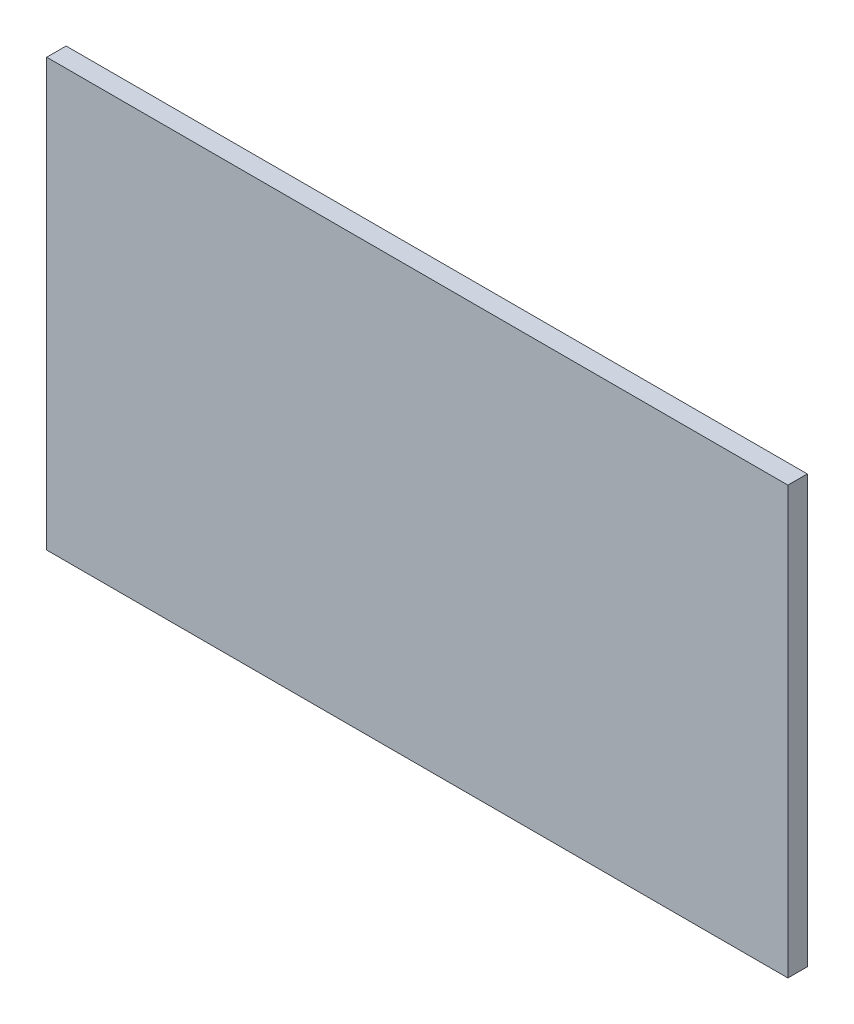
ISO-10303-21;
HEADER;
FILE_DESCRIPTION(('STEP AP214'),'2;1');
FILE_NAME('part.step','',(''),(''),'','','');
FILE_SCHEMA(('AUTOMOTIVE_DESIGN { 1 0 10303 214 1 1 1 1 }'));
ENDSEC;
DATA;
#1=APPLICATION_CONTEXT('core data for automotive mechanical design processes');
#2=APPLICATION_PROTOCOL_DEFINITION('international standard','automotive_design',2000,#1);
#3=PRODUCT_CONTEXT('',#1,'mechanical');
#4=PRODUCT('Part','Part','',(#3));
#5=PRODUCT_RELATED_PRODUCT_CATEGORY('part','',(#4));
#6=PRODUCT_DEFINITION_FORMATION('','',#4);
#7=PRODUCT_DEFINITION_CONTEXT('part definition',#1,'design');
#8=PRODUCT_DEFINITION('design','',#6,#7);
#9=PRODUCT_DEFINITION_SHAPE('','',#8);
#10=(LENGTH_UNIT() NAMED_UNIT(*) SI_UNIT(.MILLI.,.METRE.));
#11=(NAMED_UNIT(*) PLANE_ANGLE_UNIT() SI_UNIT($,.RADIAN.));
#12=(NAMED_UNIT(*) SI_UNIT($,.STERADIAN.) SOLID_ANGLE_UNIT());
#13=UNCERTAINTY_MEASURE_WITH_UNIT(LENGTH_MEASURE(1.E-05),#10,'distance_accuracy_value','');
#14=(GEOMETRIC_REPRESENTATION_CONTEXT(3) GLOBAL_UNCERTAINTY_ASSIGNED_CONTEXT((#13)) GLOBAL_UNIT_ASSIGNED_CONTEXT((#10,
#11,#12)) REPRESENTATION_CONTEXT('',''));
#15=CARTESIAN_POINT('',(0.,0.,0.));
#16=DIRECTION('',(0.,0.,1.));
#17=DIRECTION('',(1.,0.,0.));
#18=AXIS2_PLACEMENT_3D('',#15,#16,#17);
#19=CARTESIAN_POINT('',(95.5,-55.,5.));
#20=DIRECTION('',(-1.,0.,0.));
#21=DIRECTION('',(0.,0.,1.));
#22=AXIS2_PLACEMENT_3D('',#19,#20,#21);
#23=PLANE('',#22);
#24=DIRECTION('',(0.,1.,0.));
#25=VECTOR('',#24,1.);
#26=CARTESIAN_POINT('',(95.5,-55.,0.));
#27=LINE('',#26,#25);
#28=CARTESIAN_POINT('',(95.5,-55.,0.));
#29=VERTEX_POINT('',#28);
#30=CARTESIAN_POINT('',(95.5,55.,0.));
#31=VERTEX_POINT('',#30);
#32=EDGE_CURVE('E100',#29,#31,#27,.T.);
#33=ORIENTED_EDGE('',*,*,#32,.T.);
#34=DIRECTION('',(0.,0.,-1.));
#35=VECTOR('',#34,1.);
#36=CARTESIAN_POINT('',(95.5,55.,5.));
#37=LINE('',#36,#35);
#38=CARTESIAN_POINT('',(95.5,55.,5.));
#39=VERTEX_POINT('',#38);
#40=EDGE_CURVE('E11',#39,#31,#37,.T.);
#41=ORIENTED_EDGE('',*,*,#40,.F.);
#42=DIRECTION('',(0.,1.,0.));
#43=VECTOR('',#42,1.);
#44=CARTESIAN_POINT('',(95.5,-55.,5.));
#45=LINE('',#44,#43);
#46=CARTESIAN_POINT('',(95.5,-55.,5.));
#47=VERTEX_POINT('',#46);
#48=EDGE_CURVE('E88',#47,#39,#45,.T.);
#49=ORIENTED_EDGE('',*,*,#48,.F.);
#50=DIRECTION('',(0.,0.,-1.));
#51=VECTOR('',#50,1.);
#52=CARTESIAN_POINT('',(95.5,-55.,5.));
#53=LINE('',#52,#51);
#54=EDGE_CURVE('E96',#47,#29,#53,.T.);
#55=ORIENTED_EDGE('',*,*,#54,.T.);
#56=EDGE_LOOP('',(#33,#41,#49,#55));
#57=FACE_BOUND('',#56,.T.);
#58=ADVANCED_FACE('F37',(#57),#23,.F.);
#59=CARTESIAN_POINT('',(-95.5,55.,5.));
#60=DIRECTION('',(0.,-1.,0.));
#61=DIRECTION('',(0.,0.,-1.));
#62=AXIS2_PLACEMENT_3D('',#59,#60,#61);
#63=PLANE('',#62);
#64=DIRECTION('',(-1.,0.,0.));
#65=VECTOR('',#64,1.);
#66=CARTESIAN_POINT('',(-95.5,55.,0.));
#67=LINE('',#66,#65);
#68=CARTESIAN_POINT('',(-95.5,55.,0.));
#69=VERTEX_POINT('',#68);
#70=EDGE_CURVE('E92',#31,#69,#67,.T.);
#71=ORIENTED_EDGE('',*,*,#70,.T.);
#72=DIRECTION('',(0.,0.,-1.));
#73=VECTOR('',#72,1.);
#74=CARTESIAN_POINT('',(-95.5,55.,5.));
#75=LINE('',#74,#73);
#76=CARTESIAN_POINT('',(-95.5,55.,5.));
#77=VERTEX_POINT('',#76);
#78=EDGE_CURVE('E45',#77,#69,#75,.T.);
#79=ORIENTED_EDGE('',*,*,#78,.F.);
#80=DIRECTION('',(-1.,0.,0.));
#81=VECTOR('',#80,1.);
#82=CARTESIAN_POINT('',(-95.5,55.,5.));
#83=LINE('',#82,#81);
#84=EDGE_CURVE('E83',#39,#77,#83,.T.);
#85=ORIENTED_EDGE('',*,*,#84,.F.);
#86=ORIENTED_EDGE('',*,*,#40,.T.);
#87=EDGE_LOOP('',(#71,#79,#85,#86));
#88=FACE_BOUND('',#87,.T.);
#89=ADVANCED_FACE('F91',(#88),#63,.F.);
#90=CARTESIAN_POINT('',(-95.5,-55.,5.));
#91=DIRECTION('',(1.,0.,0.));
#92=DIRECTION('',(0.,0.,-1.));
#93=AXIS2_PLACEMENT_3D('',#90,#91,#92);
#94=PLANE('',#93);
#95=DIRECTION('',(0.,-1.,0.));
#96=VECTOR('',#95,1.);
#97=CARTESIAN_POINT('',(-95.5,-55.,0.));
#98=LINE('',#97,#96);
#99=CARTESIAN_POINT('',(-95.5,-55.,0.));
#100=VERTEX_POINT('',#99);
#101=EDGE_CURVE('E70',#69,#100,#98,.T.);
#102=ORIENTED_EDGE('',*,*,#101,.T.);
#103=DIRECTION('',(0.,0.,-1.));
#104=VECTOR('',#103,1.);
#105=CARTESIAN_POINT('',(-95.5,-55.,5.));
#106=LINE('',#105,#104);
#107=CARTESIAN_POINT('',(-95.5,-55.,5.));
#108=VERTEX_POINT('',#107);
#109=EDGE_CURVE('E93',#108,#100,#106,.T.);
#110=ORIENTED_EDGE('',*,*,#109,.F.);
#111=DIRECTION('',(0.,-1.,0.));
#112=VECTOR('',#111,1.);
#113=CARTESIAN_POINT('',(-95.5,-55.,5.));
#114=LINE('',#113,#112);
#115=EDGE_CURVE('E86',#77,#108,#114,.T.);
#116=ORIENTED_EDGE('',*,*,#115,.F.);
#117=ORIENTED_EDGE('',*,*,#78,.T.);
#118=EDGE_LOOP('',(#102,#110,#116,#117));
#119=FACE_BOUND('',#118,.T.);
#120=ADVANCED_FACE('F94',(#119),#94,.F.);
#121=CARTESIAN_POINT('',(-95.5,-55.,5.));
#122=DIRECTION('',(0.,1.,0.));
#123=DIRECTION('',(0.,0.,1.));
#124=AXIS2_PLACEMENT_3D('',#121,#122,#123);
#125=PLANE('',#124);
#126=DIRECTION('',(1.,0.,0.));
#127=VECTOR('',#126,1.);
#128=CARTESIAN_POINT('',(-95.5,-55.,0.));
#129=LINE('',#128,#127);
#130=EDGE_CURVE('E76',#100,#29,#129,.T.);
#131=ORIENTED_EDGE('',*,*,#130,.T.);
#132=ORIENTED_EDGE('',*,*,#54,.F.);
#133=DIRECTION('',(1.,0.,0.));
#134=VECTOR('',#133,1.);
#135=CARTESIAN_POINT('',(-95.5,-55.,5.));
#136=LINE('',#135,#134);
#137=EDGE_CURVE('E53',#108,#47,#136,.T.);
#138=ORIENTED_EDGE('',*,*,#137,.F.);
#139=ORIENTED_EDGE('',*,*,#109,.T.);
#140=EDGE_LOOP('',(#131,#132,#138,#139));
#141=FACE_BOUND('',#140,.T.);
#142=ADVANCED_FACE('F107',(#141),#125,.F.);
#143=CARTESIAN_POINT('',(0.,0.,5.));
#144=DIRECTION('',(0.,0.,-1.));
#145=DIRECTION('',(-1.,0.,0.));
#146=AXIS2_PLACEMENT_3D('',#143,#144,#145);
#147=PLANE('',#146);
#148=ORIENTED_EDGE('',*,*,#48,.T.);
#149=ORIENTED_EDGE('',*,*,#84,.T.);
#150=ORIENTED_EDGE('',*,*,#115,.T.);
#151=ORIENTED_EDGE('',*,*,#137,.T.);
#152=EDGE_LOOP('',(#148,#149,#150,#151));
#153=FACE_BOUND('',#152,.T.);
#154=ADVANCED_FACE('F84',(#153),#147,.F.);
#155=CARTESIAN_POINT('',(0.,0.,0.));
#156=DIRECTION('',(0.,0.,-1.));
#157=DIRECTION('',(-1.,0.,0.));
#158=AXIS2_PLACEMENT_3D('',#155,#156,#157);
#159=PLANE('',#158);
#160=ORIENTED_EDGE('',*,*,#32,.F.);
#161=ORIENTED_EDGE('',*,*,#130,.F.);
#162=ORIENTED_EDGE('',*,*,#101,.F.);
#163=ORIENTED_EDGE('',*,*,#70,.F.);
#164=EDGE_LOOP('',(#160,#161,#162,#163));
#165=FACE_BOUND('',#164,.T.);
#166=ADVANCED_FACE('F110',(#165),#159,.T.);
#167=CLOSED_SHELL('',(#58,#89,#120,#142,#154,#166));
#168=MANIFOLD_SOLID_BREP('B2',#167);
#169=ADVANCED_BREP_SHAPE_REPRESENTATION('',(#18,#168),#14);
#170=SHAPE_DEFINITION_REPRESENTATION(#9,#169);
ENDSEC;
END-ISO-10303-21;
